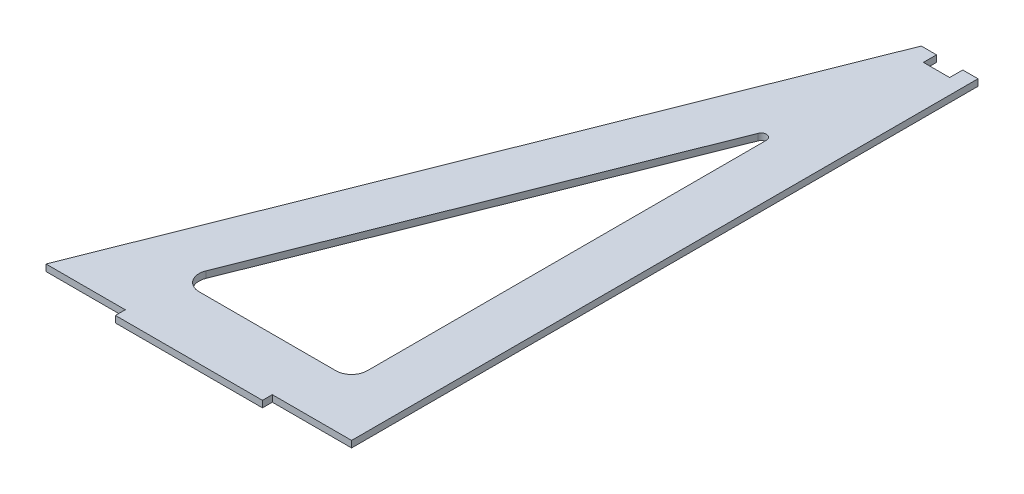
ISO-10303-21;
HEADER;
FILE_DESCRIPTION(('STEP AP214'),'2;1');
FILE_NAME('part.step','',(''),(''),'','','');
FILE_SCHEMA(('AUTOMOTIVE_DESIGN { 1 0 10303 214 1 1 1 1 }'));
ENDSEC;
DATA;
#1=APPLICATION_CONTEXT('core data for automotive mechanical design processes');
#2=APPLICATION_PROTOCOL_DEFINITION('international standard','automotive_design',2000,#1);
#3=PRODUCT_CONTEXT('',#1,'mechanical');
#4=PRODUCT('Part','Part','',(#3));
#5=PRODUCT_RELATED_PRODUCT_CATEGORY('part','',(#4));
#6=PRODUCT_DEFINITION_FORMATION('','',#4);
#7=PRODUCT_DEFINITION_CONTEXT('part definition',#1,'design');
#8=PRODUCT_DEFINITION('design','',#6,#7);
#9=PRODUCT_DEFINITION_SHAPE('','',#8);
#10=(LENGTH_UNIT() NAMED_UNIT(*) SI_UNIT(.MILLI.,.METRE.));
#11=(NAMED_UNIT(*) PLANE_ANGLE_UNIT() SI_UNIT($,.RADIAN.));
#12=(NAMED_UNIT(*) SI_UNIT($,.STERADIAN.) SOLID_ANGLE_UNIT());
#13=UNCERTAINTY_MEASURE_WITH_UNIT(LENGTH_MEASURE(1.E-05),#10,'distance_accuracy_value','');
#14=(GEOMETRIC_REPRESENTATION_CONTEXT(3) GLOBAL_UNCERTAINTY_ASSIGNED_CONTEXT((#13)) GLOBAL_UNIT_ASSIGNED_CONTEXT((#10,
#11,#12)) REPRESENTATION_CONTEXT('',''));
#15=CARTESIAN_POINT('',(0.,0.,0.));
#16=DIRECTION('',(0.,0.,1.));
#17=DIRECTION('',(1.,0.,0.));
#18=AXIS2_PLACEMENT_3D('',#15,#16,#17);
#19=CARTESIAN_POINT('',(0.,3.175,0.));
#20=DIRECTION('',(0.,0.,-1.));
#21=DIRECTION('',(-1.,0.,0.));
#22=AXIS2_PLACEMENT_3D('',#19,#20,#21);
#23=PLANE('',#22);
#24=DIRECTION('',(0.,-1.,0.));
#25=VECTOR('',#24,1.);
#26=CARTESIAN_POINT('',(-109.474,0.,0.));
#27=LINE('',#26,#25);
#28=CARTESIAN_POINT('',(-109.474,3.175,0.));
#29=VERTEX_POINT('',#28);
#30=CARTESIAN_POINT('',(-109.474,0.,0.));
#31=VERTEX_POINT('',#30);
#32=EDGE_CURVE('E55',#29,#31,#27,.T.);
#33=ORIENTED_EDGE('',*,*,#32,.F.);
#34=DIRECTION('',(1.,0.,0.));
#35=VECTOR('',#34,1.);
#36=CARTESIAN_POINT('',(0.,3.175,0.));
#37=LINE('',#36,#35);
#38=CARTESIAN_POINT('',(-147.828,3.175,0.));
#39=VERTEX_POINT('',#38);
#40=EDGE_CURVE('E269',#39,#29,#37,.T.);
#41=ORIENTED_EDGE('',*,*,#40,.F.);
#42=DIRECTION('',(0.,-1.,0.));
#43=VECTOR('',#42,1.);
#44=CARTESIAN_POINT('',(-147.828,3.175,0.));
#45=LINE('',#44,#43);
#46=CARTESIAN_POINT('',(-147.828,0.,0.));
#47=VERTEX_POINT('',#46);
#48=EDGE_CURVE('E290',#39,#47,#45,.T.);
#49=ORIENTED_EDGE('',*,*,#48,.T.);
#50=DIRECTION('',(1.,0.,0.));
#51=VECTOR('',#50,1.);
#52=CARTESIAN_POINT('',(0.,0.,0.));
#53=LINE('',#52,#51);
#54=EDGE_CURVE('E260',#47,#31,#53,.T.);
#55=ORIENTED_EDGE('',*,*,#54,.T.);
#56=EDGE_LOOP('',(#33,#41,#49,#55));
#57=FACE_BOUND('',#56,.T.);
#58=ADVANCED_FACE('F39',(#57),#23,.F.);
#59=DIRECTION('',(0.,1.,0.));
#60=VECTOR('',#59,1.);
#61=CARTESIAN_POINT('',(-38.354,0.,0.));
#62=LINE('',#61,#60);
#63=CARTESIAN_POINT('',(-38.354,0.,0.));
#64=VERTEX_POINT('',#63);
#65=CARTESIAN_POINT('',(-38.354,3.175,0.));
#66=VERTEX_POINT('',#65);
#67=EDGE_CURVE('E63',#64,#66,#62,.T.);
#68=ORIENTED_EDGE('',*,*,#67,.F.);
#69=CARTESIAN_POINT('',(0.,0.,0.));
#70=VERTEX_POINT('',#69);
#71=EDGE_CURVE('E284',#64,#70,#53,.T.);
#72=ORIENTED_EDGE('',*,*,#71,.T.);
#73=DIRECTION('',(0.,-1.,0.));
#74=VECTOR('',#73,1.);
#75=CARTESIAN_POINT('',(0.,3.175,0.));
#76=LINE('',#75,#74);
#77=CARTESIAN_POINT('',(0.,3.175,0.));
#78=VERTEX_POINT('',#77);
#79=EDGE_CURVE('E272',#78,#70,#76,.T.);
#80=ORIENTED_EDGE('',*,*,#79,.F.);
#81=EDGE_CURVE('E268',#66,#78,#37,.T.);
#82=ORIENTED_EDGE('',*,*,#81,.F.);
#83=EDGE_LOOP('',(#68,#72,#80,#82));
#84=FACE_BOUND('',#83,.T.);
#85=ADVANCED_FACE('F376',(#84),#23,.F.);
#86=CARTESIAN_POINT('',(-27.432,3.175,-303.022));
#87=DIRECTION('',(0.,0.,1.));
#88=DIRECTION('',(1.,0.,0.));
#89=AXIS2_PLACEMENT_3D('',#86,#87,#88);
#90=PLANE('',#89);
#91=DIRECTION('',(-1.,0.,0.));
#92=VECTOR('',#91,1.);
#93=CARTESIAN_POINT('',(-27.432,0.,-303.022));
#94=LINE('',#93,#92);
#95=CARTESIAN_POINT('',(0.,0.,-303.022));
#96=VERTEX_POINT('',#95);
#97=CARTESIAN_POINT('',(-7.366,0.,-303.022));
#98=VERTEX_POINT('',#97);
#99=EDGE_CURVE('E277',#96,#98,#94,.T.);
#100=ORIENTED_EDGE('',*,*,#99,.T.);
#101=DIRECTION('',(0.,1.,0.));
#102=VECTOR('',#101,1.);
#103=CARTESIAN_POINT('',(-7.366,0.,-303.022));
#104=LINE('',#103,#102);
#105=CARTESIAN_POINT('',(-7.366,3.175,-303.022));
#106=VERTEX_POINT('',#105);
#107=EDGE_CURVE('E220',#98,#106,#104,.T.);
#108=ORIENTED_EDGE('',*,*,#107,.T.);
#109=DIRECTION('',(-1.,0.,0.));
#110=VECTOR('',#109,1.);
#111=CARTESIAN_POINT('',(-27.432,3.175,-303.022));
#112=LINE('',#111,#110);
#113=CARTESIAN_POINT('',(0.,3.175,-303.022));
#114=VERTEX_POINT('',#113);
#115=EDGE_CURVE('E261',#114,#106,#112,.T.);
#116=ORIENTED_EDGE('',*,*,#115,.F.);
#117=DIRECTION('',(0.,-1.,0.));
#118=VECTOR('',#117,1.);
#119=CARTESIAN_POINT('',(0.,3.175,-303.022));
#120=LINE('',#119,#118);
#121=EDGE_CURVE('E298',#114,#96,#120,.T.);
#122=ORIENTED_EDGE('',*,*,#121,.T.);
#123=EDGE_LOOP('',(#100,#108,#116,#122));
#124=FACE_BOUND('',#123,.T.);
#125=ADVANCED_FACE('F381',(#124),#90,.F.);
#126=CARTESIAN_POINT('',(0.,3.175,-303.022));
#127=DIRECTION('',(-1.,0.,0.));
#128=DIRECTION('',(0.,0.,1.));
#129=AXIS2_PLACEMENT_3D('',#126,#127,#128);
#130=PLANE('',#129);
#131=DIRECTION('',(0.,0.,-1.));
#132=VECTOR('',#131,1.);
#133=CARTESIAN_POINT('',(0.,0.,-303.022));
#134=LINE('',#133,#132);
#135=EDGE_CURVE('E214',#70,#96,#134,.T.);
#136=ORIENTED_EDGE('',*,*,#135,.T.);
#137=ORIENTED_EDGE('',*,*,#121,.F.);
#138=DIRECTION('',(0.,0.,-1.));
#139=VECTOR('',#138,1.);
#140=CARTESIAN_POINT('',(0.,3.175,-303.022));
#141=LINE('',#140,#139);
#142=EDGE_CURVE('E255',#78,#114,#141,.T.);
#143=ORIENTED_EDGE('',*,*,#142,.F.);
#144=ORIENTED_EDGE('',*,*,#79,.T.);
#145=EDGE_LOOP('',(#136,#137,#143,#144));
#146=FACE_BOUND('',#145,.T.);
#147=ADVANCED_FACE('F391',(#146),#130,.F.);
#148=CARTESIAN_POINT('',(-20.066,3.175,-303.022));
#149=VERTEX_POINT('',#148);
#150=CARTESIAN_POINT('',(-27.432,3.175,-303.022));
#151=VERTEX_POINT('',#150);
#152=EDGE_CURVE('E259',#149,#151,#112,.T.);
#153=ORIENTED_EDGE('',*,*,#152,.F.);
#154=DIRECTION('',(0.,1.,0.));
#155=VECTOR('',#154,1.);
#156=CARTESIAN_POINT('',(-20.066,0.,-303.022));
#157=LINE('',#156,#155);
#158=CARTESIAN_POINT('',(-20.066,0.,-303.022));
#159=VERTEX_POINT('',#158);
#160=EDGE_CURVE('E237',#159,#149,#157,.T.);
#161=ORIENTED_EDGE('',*,*,#160,.F.);
#162=CARTESIAN_POINT('',(-27.432,0.,-303.022));
#163=VERTEX_POINT('',#162);
#164=EDGE_CURVE('E276',#159,#163,#94,.T.);
#165=ORIENTED_EDGE('',*,*,#164,.T.);
#166=DIRECTION('',(0.,-1.,0.));
#167=VECTOR('',#166,1.);
#168=CARTESIAN_POINT('',(-27.432,3.175,-303.022));
#169=LINE('',#168,#167);
#170=EDGE_CURVE('E294',#151,#163,#169,.T.);
#171=ORIENTED_EDGE('',*,*,#170,.F.);
#172=EDGE_LOOP('',(#153,#161,#165,#171));
#173=FACE_BOUND('',#172,.T.);
#174=ADVANCED_FACE('F388',(#173),#90,.F.);
#175=CARTESIAN_POINT('',(-147.828,3.175,0.));
#176=DIRECTION('',(0.92933377803258,0.,0.369240746678494));
#177=DIRECTION('',(0.369240746678494,0.,-0.92933377803258));
#178=AXIS2_PLACEMENT_3D('',#175,#176,#177);
#179=PLANE('',#178);
#180=DIRECTION('',(-0.369240746678494,0.,0.92933377803258));
#181=VECTOR('',#180,1.);
#182=CARTESIAN_POINT('',(-147.828,0.,0.));
#183=LINE('',#182,#181);
#184=EDGE_CURVE('E281',#163,#47,#183,.T.);
#185=ORIENTED_EDGE('',*,*,#184,.T.);
#186=ORIENTED_EDGE('',*,*,#48,.F.);
#187=DIRECTION('',(-0.369240746678494,0.,0.92933377803258));
#188=VECTOR('',#187,1.);
#189=CARTESIAN_POINT('',(-147.828,3.175,0.));
#190=LINE('',#189,#188);
#191=EDGE_CURVE('E265',#151,#39,#190,.T.);
#192=ORIENTED_EDGE('',*,*,#191,.F.);
#193=ORIENTED_EDGE('',*,*,#170,.T.);
#194=EDGE_LOOP('',(#185,#186,#192,#193));
#195=FACE_BOUND('',#194,.T.);
#196=ADVANCED_FACE('F385',(#195),#179,.F.);
#197=CARTESIAN_POINT('',(0.,3.175,0.));
#198=DIRECTION('',(0.,-1.,0.));
#199=DIRECTION('',(0.,0.,-1.));
#200=AXIS2_PLACEMENT_3D('',#197,#198,#199);
#201=PLANE('',#200);
#202=DIRECTION('',(0.,0.,-1.));
#203=VECTOR('',#202,1.);
#204=CARTESIAN_POINT('',(-25.4,3.175,-25.4));
#205=LINE('',#204,#203);
#206=CARTESIAN_POINT('',(-25.4,3.175,-33.02));
#207=VERTEX_POINT('',#206);
#208=CARTESIAN_POINT('',(-25.4,3.175,-226.074637568249));
#209=VERTEX_POINT('',#208);
#210=EDGE_CURVE('E219',#207,#209,#205,.T.);
#211=ORIENTED_EDGE('',*,*,#210,.F.);
#212=CARTESIAN_POINT('',(-33.02,3.175,-33.02));
#213=DIRECTION('',(0.,-1.,0.));
#214=DIRECTION('',(0.,0.,-1.));
#215=AXIS2_PLACEMENT_3D('',#212,#213,#214);
#216=CIRCLE('',#215,7.62);
#217=CARTESIAN_POINT('',(-33.02,3.175,-25.4));
#218=VERTEX_POINT('',#217);
#219=EDGE_CURVE('E317',#207,#218,#216,.T.);
#220=ORIENTED_EDGE('',*,*,#219,.T.);
#221=DIRECTION('',(1.,0.,0.));
#222=VECTOR('',#221,1.);
#223=CARTESIAN_POINT('',(-110.404723468224,3.175,-25.4));
#224=LINE('',#223,#222);
#225=CARTESIAN_POINT('',(-99.1777405086907,3.175,-25.4));
#226=VERTEX_POINT('',#225);
#227=EDGE_CURVE('E215',#226,#218,#224,.T.);
#228=ORIENTED_EDGE('',*,*,#227,.F.);
#229=CARTESIAN_POINT('',(-99.1777405086907,3.175,-33.02));
#230=DIRECTION('',(0.,-1.,0.));
#231=DIRECTION('',(0.,0.,-1.));
#232=AXIS2_PLACEMENT_3D('',#229,#230,#231);
#233=CIRCLE('',#232,7.62);
#234=CARTESIAN_POINT('',(-106.259263897299,3.175,-35.8336144896901));
#235=VERTEX_POINT('',#234);
#236=EDGE_CURVE('E323',#226,#235,#233,.T.);
#237=ORIENTED_EDGE('',*,*,#236,.T.);
#238=DIRECTION('',(-0.369240746678494,0.,0.92933377803258));
#239=VECTOR('',#238,1.);
#240=CARTESIAN_POINT('',(-25.4,3.175,-239.34648754766));
#241=LINE('',#240,#239);
#242=CARTESIAN_POINT('',(-30.3005077962028,3.175,-227.012509064812));
#243=VERTEX_POINT('',#242);
#244=EDGE_CURVE('E207',#243,#235,#241,.T.);
#245=ORIENTED_EDGE('',*,*,#244,.F.);
#246=CARTESIAN_POINT('',(-27.94,3.175,-226.074637568249));
#247=DIRECTION('',(0.,-1.,0.));
#248=DIRECTION('',(0.,0.,-1.));
#249=AXIS2_PLACEMENT_3D('',#246,#247,#248);
#250=CIRCLE('',#249,2.54);
#251=EDGE_CURVE('E48',#243,#209,#250,.T.);
#252=ORIENTED_EDGE('',*,*,#251,.T.);
#253=EDGE_LOOP('',(#211,#220,#228,#237,#245,#252));
#254=FACE_BOUND('',#253,.T.);
#255=ORIENTED_EDGE('',*,*,#115,.T.);
#256=DIRECTION('',(0.,0.,-1.));
#257=VECTOR('',#256,1.);
#258=CARTESIAN_POINT('',(-7.366,3.175,-303.022));
#259=LINE('',#258,#257);
#260=CARTESIAN_POINT('',(-7.36600000000001,3.175,-296.672));
#261=VERTEX_POINT('',#260);
#262=EDGE_CURVE('E231',#261,#106,#259,.T.);
#263=ORIENTED_EDGE('',*,*,#262,.F.);
#264=DIRECTION('',(1.,0.,0.));
#265=VECTOR('',#264,1.);
#266=CARTESIAN_POINT('',(-20.066,3.175,-296.672));
#267=LINE('',#266,#265);
#268=CARTESIAN_POINT('',(-20.066,3.175,-296.672));
#269=VERTEX_POINT('',#268);
#270=EDGE_CURVE('E196',#269,#261,#267,.T.);
#271=ORIENTED_EDGE('',*,*,#270,.F.);
#272=DIRECTION('',(0.,0.,1.));
#273=VECTOR('',#272,1.);
#274=CARTESIAN_POINT('',(-20.066,3.175,-303.022));
#275=LINE('',#274,#273);
#276=EDGE_CURVE('E191',#149,#269,#275,.T.);
#277=ORIENTED_EDGE('',*,*,#276,.F.);
#278=ORIENTED_EDGE('',*,*,#152,.T.);
#279=ORIENTED_EDGE('',*,*,#191,.T.);
#280=ORIENTED_EDGE('',*,*,#40,.T.);
#281=DIRECTION('',(0.,0.,-1.));
#282=VECTOR('',#281,1.);
#283=CARTESIAN_POINT('',(-109.474,3.175,4.7625));
#284=LINE('',#283,#282);
#285=CARTESIAN_POINT('',(-109.474,3.175,4.7625));
#286=VERTEX_POINT('',#285);
#287=EDGE_CURVE('E417',#286,#29,#284,.T.);
#288=ORIENTED_EDGE('',*,*,#287,.F.);
#289=DIRECTION('',(-1.,0.,0.));
#290=VECTOR('',#289,1.);
#291=CARTESIAN_POINT('',(-38.354,3.175,4.7625));
#292=LINE('',#291,#290);
#293=CARTESIAN_POINT('',(-38.354,3.175,4.7625));
#294=VERTEX_POINT('',#293);
#295=EDGE_CURVE('E183',#294,#286,#292,.T.);
#296=ORIENTED_EDGE('',*,*,#295,.F.);
#297=DIRECTION('',(0.,0.,-1.));
#298=VECTOR('',#297,1.);
#299=CARTESIAN_POINT('',(-38.354,3.175,4.7625));
#300=LINE('',#299,#298);
#301=EDGE_CURVE('E198',#294,#66,#300,.T.);
#302=ORIENTED_EDGE('',*,*,#301,.T.);
#303=ORIENTED_EDGE('',*,*,#81,.T.);
#304=ORIENTED_EDGE('',*,*,#142,.T.);
#305=EDGE_LOOP('',(#255,#263,#271,#277,#278,#279,#280,#288,#296,#302,#303,#304));
#306=FACE_BOUND('',#305,.T.);
#307=ADVANCED_FACE('F340',(#254,#306),#201,.F.);
#308=CARTESIAN_POINT('',(0.,0.,0.));
#309=DIRECTION('',(0.,-1.,0.));
#310=DIRECTION('',(0.,0.,-1.));
#311=AXIS2_PLACEMENT_3D('',#308,#309,#310);
#312=PLANE('',#311);
#313=DIRECTION('',(0.,0.,-1.));
#314=VECTOR('',#313,1.);
#315=CARTESIAN_POINT('',(-25.4,0.,-25.4));
#316=LINE('',#315,#314);
#317=CARTESIAN_POINT('',(-25.4,0.,-33.02));
#318=VERTEX_POINT('',#317);
#319=CARTESIAN_POINT('',(-25.4,0.,-226.074637568249));
#320=VERTEX_POINT('',#319);
#321=EDGE_CURVE('E206',#318,#320,#316,.T.);
#322=ORIENTED_EDGE('',*,*,#321,.T.);
#323=CARTESIAN_POINT('',(-27.94,0.,-226.074637568249));
#324=DIRECTION('',(0.,-1.,0.));
#325=DIRECTION('',(0.,0.,-1.));
#326=AXIS2_PLACEMENT_3D('',#323,#324,#325);
#327=CIRCLE('',#326,2.54);
#328=CARTESIAN_POINT('',(-30.3005077962028,0.,-227.012509064812));
#329=VERTEX_POINT('',#328);
#330=EDGE_CURVE('E11',#320,#329,#327,.F.);
#331=ORIENTED_EDGE('',*,*,#330,.T.);
#332=DIRECTION('',(-0.369240746678494,0.,0.92933377803258));
#333=VECTOR('',#332,1.);
#334=CARTESIAN_POINT('',(-25.4,0.,-239.34648754766));
#335=LINE('',#334,#333);
#336=CARTESIAN_POINT('',(-106.259263897299,0.,-35.8336144896901));
#337=VERTEX_POINT('',#336);
#338=EDGE_CURVE('E211',#329,#337,#335,.T.);
#339=ORIENTED_EDGE('',*,*,#338,.T.);
#340=CARTESIAN_POINT('',(-99.1777405086907,0.,-33.02));
#341=DIRECTION('',(0.,-1.,0.));
#342=DIRECTION('',(0.,0.,-1.));
#343=AXIS2_PLACEMENT_3D('',#340,#341,#342);
#344=CIRCLE('',#343,7.62);
#345=CARTESIAN_POINT('',(-99.1777405086907,0.,-25.4));
#346=VERTEX_POINT('',#345);
#347=EDGE_CURVE('E327',#337,#346,#344,.F.);
#348=ORIENTED_EDGE('',*,*,#347,.T.);
#349=DIRECTION('',(1.,0.,0.));
#350=VECTOR('',#349,1.);
#351=CARTESIAN_POINT('',(-110.404723468224,0.,-25.4));
#352=LINE('',#351,#350);
#353=CARTESIAN_POINT('',(-33.02,0.,-25.4));
#354=VERTEX_POINT('',#353);
#355=EDGE_CURVE('E202',#346,#354,#352,.T.);
#356=ORIENTED_EDGE('',*,*,#355,.T.);
#357=CARTESIAN_POINT('',(-33.02,0.,-33.02));
#358=DIRECTION('',(0.,-1.,0.));
#359=DIRECTION('',(0.,0.,-1.));
#360=AXIS2_PLACEMENT_3D('',#357,#358,#359);
#361=CIRCLE('',#360,7.62);
#362=EDGE_CURVE('E320',#354,#318,#361,.F.);
#363=ORIENTED_EDGE('',*,*,#362,.T.);
#364=EDGE_LOOP('',(#322,#331,#339,#348,#356,#363));
#365=FACE_BOUND('',#364,.T.);
#366=DIRECTION('',(0.,0.,-1.));
#367=VECTOR('',#366,1.);
#368=CARTESIAN_POINT('',(-7.366,0.,-303.022));
#369=LINE('',#368,#367);
#370=CARTESIAN_POINT('',(-7.36600000000001,0.,-296.672));
#371=VERTEX_POINT('',#370);
#372=EDGE_CURVE('E235',#371,#98,#369,.T.);
#373=ORIENTED_EDGE('',*,*,#372,.T.);
#374=ORIENTED_EDGE('',*,*,#99,.F.);
#375=ORIENTED_EDGE('',*,*,#135,.F.);
#376=ORIENTED_EDGE('',*,*,#71,.F.);
#377=DIRECTION('',(0.,0.,-1.));
#378=VECTOR('',#377,1.);
#379=CARTESIAN_POINT('',(-38.354,0.,4.7625));
#380=LINE('',#379,#378);
#381=CARTESIAN_POINT('',(-38.354,0.,4.7625));
#382=VERTEX_POINT('',#381);
#383=EDGE_CURVE('E173',#382,#64,#380,.T.);
#384=ORIENTED_EDGE('',*,*,#383,.F.);
#385=DIRECTION('',(1.,0.,0.));
#386=VECTOR('',#385,1.);
#387=CARTESIAN_POINT('',(-38.354,0.,4.7625));
#388=LINE('',#387,#386);
#389=CARTESIAN_POINT('',(-109.474,0.,4.7625));
#390=VERTEX_POINT('',#389);
#391=EDGE_CURVE('E165',#390,#382,#388,.T.);
#392=ORIENTED_EDGE('',*,*,#391,.F.);
#393=DIRECTION('',(0.,0.,-1.));
#394=VECTOR('',#393,1.);
#395=CARTESIAN_POINT('',(-109.474,0.,4.7625));
#396=LINE('',#395,#394);
#397=EDGE_CURVE('E171',#390,#31,#396,.T.);
#398=ORIENTED_EDGE('',*,*,#397,.T.);
#399=ORIENTED_EDGE('',*,*,#54,.F.);
#400=ORIENTED_EDGE('',*,*,#184,.F.);
#401=ORIENTED_EDGE('',*,*,#164,.F.);
#402=DIRECTION('',(0.,0.,1.));
#403=VECTOR('',#402,1.);
#404=CARTESIAN_POINT('',(-20.066,0.,-303.022));
#405=LINE('',#404,#403);
#406=CARTESIAN_POINT('',(-20.066,0.,-296.672));
#407=VERTEX_POINT('',#406);
#408=EDGE_CURVE('E226',#159,#407,#405,.T.);
#409=ORIENTED_EDGE('',*,*,#408,.T.);
#410=DIRECTION('',(1.,0.,0.));
#411=VECTOR('',#410,1.);
#412=CARTESIAN_POINT('',(-20.066,0.,-296.672));
#413=LINE('',#412,#411);
#414=EDGE_CURVE('E230',#407,#371,#413,.T.);
#415=ORIENTED_EDGE('',*,*,#414,.T.);
#416=EDGE_LOOP('',(#373,#374,#375,#376,#384,#392,#398,#399,#400,#401,#409,#415));
#417=FACE_BOUND('',#416,.T.);
#418=ADVANCED_FACE('F168',(#365,#417),#312,.T.);
#419=CARTESIAN_POINT('',(-7.366,0.,-303.022));
#420=DIRECTION('',(1.,0.,0.));
#421=DIRECTION('',(0.,0.,-1.));
#422=AXIS2_PLACEMENT_3D('',#419,#420,#421);
#423=PLANE('',#422);
#424=ORIENTED_EDGE('',*,*,#262,.T.);
#425=ORIENTED_EDGE('',*,*,#107,.F.);
#426=ORIENTED_EDGE('',*,*,#372,.F.);
#427=DIRECTION('',(0.,1.,0.));
#428=VECTOR('',#427,1.);
#429=CARTESIAN_POINT('',(-7.36600000000001,0.,-296.672));
#430=LINE('',#429,#428);
#431=EDGE_CURVE('E247',#371,#261,#430,.T.);
#432=ORIENTED_EDGE('',*,*,#431,.T.);
#433=EDGE_LOOP('',(#424,#425,#426,#432));
#434=FACE_BOUND('',#433,.T.);
#435=ADVANCED_FACE('F445',(#434),#423,.F.);
#436=CARTESIAN_POINT('',(-20.066,0.,-296.672));
#437=DIRECTION('',(0.,0.,1.));
#438=DIRECTION('',(1.,0.,0.));
#439=AXIS2_PLACEMENT_3D('',#436,#437,#438);
#440=PLANE('',#439);
#441=ORIENTED_EDGE('',*,*,#270,.T.);
#442=ORIENTED_EDGE('',*,*,#431,.F.);
#443=ORIENTED_EDGE('',*,*,#414,.F.);
#444=DIRECTION('',(0.,1.,0.));
#445=VECTOR('',#444,1.);
#446=CARTESIAN_POINT('',(-20.066,0.,-296.672));
#447=LINE('',#446,#445);
#448=EDGE_CURVE('E250',#407,#269,#447,.T.);
#449=ORIENTED_EDGE('',*,*,#448,.T.);
#450=EDGE_LOOP('',(#441,#442,#443,#449));
#451=FACE_BOUND('',#450,.T.);
#452=ADVANCED_FACE('F448',(#451),#440,.F.);
#453=CARTESIAN_POINT('',(-20.066,0.,-303.022));
#454=DIRECTION('',(-1.,0.,0.));
#455=DIRECTION('',(0.,0.,1.));
#456=AXIS2_PLACEMENT_3D('',#453,#454,#455);
#457=PLANE('',#456);
#458=ORIENTED_EDGE('',*,*,#276,.T.);
#459=ORIENTED_EDGE('',*,*,#448,.F.);
#460=ORIENTED_EDGE('',*,*,#408,.F.);
#461=ORIENTED_EDGE('',*,*,#160,.T.);
#462=EDGE_LOOP('',(#458,#459,#460,#461));
#463=FACE_BOUND('',#462,.T.);
#464=ADVANCED_FACE('F444',(#463),#457,.F.);
#465=CARTESIAN_POINT('',(-110.404723468224,0.,-25.4));
#466=DIRECTION('',(0.,0.,1.));
#467=DIRECTION('',(1.,0.,0.));
#468=AXIS2_PLACEMENT_3D('',#465,#466,#467);
#469=PLANE('',#468);
#470=ORIENTED_EDGE('',*,*,#227,.T.);
#471=DIRECTION('',(0.,1.,0.));
#472=VECTOR('',#471,1.);
#473=CARTESIAN_POINT('',(-33.02,0.,-25.4));
#474=LINE('',#473,#472);
#475=EDGE_CURVE('E310',#218,#354,#474,.F.);
#476=ORIENTED_EDGE('',*,*,#475,.T.);
#477=ORIENTED_EDGE('',*,*,#355,.F.);
#478=DIRECTION('',(0.,1.,0.));
#479=VECTOR('',#478,1.);
#480=CARTESIAN_POINT('',(-99.1777405086907,3.175,-25.4));
#481=LINE('',#480,#479);
#482=EDGE_CURVE('E306',#346,#226,#481,.T.);
#483=ORIENTED_EDGE('',*,*,#482,.T.);
#484=EDGE_LOOP('',(#470,#476,#477,#483));
#485=FACE_BOUND('',#484,.T.);
#486=ADVANCED_FACE('F362',(#485),#469,.F.);
#487=CARTESIAN_POINT('',(-25.4,0.,-239.34648754766));
#488=DIRECTION('',(-0.92933377803258,0.,-0.369240746678494));
#489=DIRECTION('',(-0.369240746678494,0.,0.92933377803258));
#490=AXIS2_PLACEMENT_3D('',#487,#488,#489);
#491=PLANE('',#490);
#492=ORIENTED_EDGE('',*,*,#338,.F.);
#493=DIRECTION('',(0.,1.,0.));
#494=VECTOR('',#493,1.);
#495=CARTESIAN_POINT('',(-30.3005077962028,3.175,-227.012509064812));
#496=LINE('',#495,#494);
#497=EDGE_CURVE('E330',#329,#243,#496,.T.);
#498=ORIENTED_EDGE('',*,*,#497,.T.);
#499=ORIENTED_EDGE('',*,*,#244,.T.);
#500=DIRECTION('',(0.,1.,0.));
#501=VECTOR('',#500,1.);
#502=CARTESIAN_POINT('',(-106.259263897299,0.,-35.8336144896901));
#503=LINE('',#502,#501);
#504=EDGE_CURVE('E313',#235,#337,#503,.F.);
#505=ORIENTED_EDGE('',*,*,#504,.T.);
#506=EDGE_LOOP('',(#492,#498,#499,#505));
#507=FACE_BOUND('',#506,.T.);
#508=ADVANCED_FACE('F353',(#507),#491,.F.);
#509=CARTESIAN_POINT('',(-25.4,0.,-25.4));
#510=DIRECTION('',(1.,0.,0.));
#511=DIRECTION('',(0.,0.,-1.));
#512=AXIS2_PLACEMENT_3D('',#509,#510,#511);
#513=PLANE('',#512);
#514=ORIENTED_EDGE('',*,*,#210,.T.);
#515=DIRECTION('',(0.,1.,0.));
#516=VECTOR('',#515,1.);
#517=CARTESIAN_POINT('',(-25.4,0.,-226.074637568249));
#518=LINE('',#517,#516);
#519=EDGE_CURVE('E334',#209,#320,#518,.F.);
#520=ORIENTED_EDGE('',*,*,#519,.T.);
#521=ORIENTED_EDGE('',*,*,#321,.F.);
#522=DIRECTION('',(0.,1.,0.));
#523=VECTOR('',#522,1.);
#524=CARTESIAN_POINT('',(-25.4,3.175,-33.02));
#525=LINE('',#524,#523);
#526=EDGE_CURVE('E302',#318,#207,#525,.T.);
#527=ORIENTED_EDGE('',*,*,#526,.T.);
#528=EDGE_LOOP('',(#514,#520,#521,#527));
#529=FACE_BOUND('',#528,.T.);
#530=ADVANCED_FACE('F346',(#529),#513,.F.);
#531=CARTESIAN_POINT('',(-33.02,0.,-33.02));
#532=DIRECTION('',(0.,-1.,0.));
#533=DIRECTION('',(0.,0.,-1.));
#534=AXIS2_PLACEMENT_3D('',#531,#532,#533);
#535=CYLINDRICAL_SURFACE('',#534,7.62);
#536=ORIENTED_EDGE('',*,*,#362,.F.);
#537=ORIENTED_EDGE('',*,*,#475,.F.);
#538=ORIENTED_EDGE('',*,*,#219,.F.);
#539=ORIENTED_EDGE('',*,*,#526,.F.);
#540=EDGE_LOOP('',(#536,#537,#538,#539));
#541=FACE_BOUND('',#540,.T.);
#542=ADVANCED_FACE('F366',(#541),#535,.F.);
#543=CARTESIAN_POINT('',(-99.1777405086907,0.,-33.02));
#544=DIRECTION('',(0.,-1.,0.));
#545=DIRECTION('',(0.,0.,-1.));
#546=AXIS2_PLACEMENT_3D('',#543,#544,#545);
#547=CYLINDRICAL_SURFACE('',#546,7.62);
#548=ORIENTED_EDGE('',*,*,#347,.F.);
#549=ORIENTED_EDGE('',*,*,#504,.F.);
#550=ORIENTED_EDGE('',*,*,#236,.F.);
#551=ORIENTED_EDGE('',*,*,#482,.F.);
#552=EDGE_LOOP('',(#548,#549,#550,#551));
#553=FACE_BOUND('',#552,.T.);
#554=ADVANCED_FACE('F358',(#553),#547,.F.);
#555=CARTESIAN_POINT('',(-27.94,0.,-226.074637568249));
#556=DIRECTION('',(0.,-1.,0.));
#557=DIRECTION('',(0.,0.,-1.));
#558=AXIS2_PLACEMENT_3D('',#555,#556,#557);
#559=CYLINDRICAL_SURFACE('',#558,2.54);
#560=ORIENTED_EDGE('',*,*,#330,.F.);
#561=ORIENTED_EDGE('',*,*,#519,.F.);
#562=ORIENTED_EDGE('',*,*,#251,.F.);
#563=ORIENTED_EDGE('',*,*,#497,.F.);
#564=EDGE_LOOP('',(#560,#561,#562,#563));
#565=FACE_BOUND('',#564,.T.);
#566=ADVANCED_FACE('F41',(#565),#559,.F.);
#567=CARTESIAN_POINT('',(-109.474,0.,4.7625));
#568=DIRECTION('',(1.,0.,0.));
#569=DIRECTION('',(0.,0.,-1.));
#570=AXIS2_PLACEMENT_3D('',#567,#568,#569);
#571=PLANE('',#570);
#572=ORIENTED_EDGE('',*,*,#32,.T.);
#573=ORIENTED_EDGE('',*,*,#397,.F.);
#574=DIRECTION('',(0.,-1.,0.));
#575=VECTOR('',#574,1.);
#576=CARTESIAN_POINT('',(-109.474,0.,4.7625));
#577=LINE('',#576,#575);
#578=EDGE_CURVE('E178',#286,#390,#577,.T.);
#579=ORIENTED_EDGE('',*,*,#578,.F.);
#580=ORIENTED_EDGE('',*,*,#287,.T.);
#581=EDGE_LOOP('',(#572,#573,#579,#580));
#582=FACE_BOUND('',#581,.T.);
#583=ADVANCED_FACE('F189',(#582),#571,.F.);
#584=CARTESIAN_POINT('',(-38.354,0.,4.7625));
#585=DIRECTION('',(-1.,0.,0.));
#586=DIRECTION('',(0.,0.,1.));
#587=AXIS2_PLACEMENT_3D('',#584,#585,#586);
#588=PLANE('',#587);
#589=ORIENTED_EDGE('',*,*,#67,.T.);
#590=ORIENTED_EDGE('',*,*,#301,.F.);
#591=DIRECTION('',(0.,1.,0.));
#592=VECTOR('',#591,1.);
#593=CARTESIAN_POINT('',(-38.354,0.,4.7625));
#594=LINE('',#593,#592);
#595=EDGE_CURVE('E177',#382,#294,#594,.T.);
#596=ORIENTED_EDGE('',*,*,#595,.F.);
#597=ORIENTED_EDGE('',*,*,#383,.T.);
#598=EDGE_LOOP('',(#589,#590,#596,#597));
#599=FACE_BOUND('',#598,.T.);
#600=ADVANCED_FACE('F430',(#599),#588,.F.);
#601=CARTESIAN_POINT('',(0.,0.,4.7625));
#602=DIRECTION('',(0.,0.,1.));
#603=DIRECTION('',(1.,0.,0.));
#604=AXIS2_PLACEMENT_3D('',#601,#602,#603);
#605=PLANE('',#604);
#606=ORIENTED_EDGE('',*,*,#578,.T.);
#607=ORIENTED_EDGE('',*,*,#391,.T.);
#608=ORIENTED_EDGE('',*,*,#595,.T.);
#609=ORIENTED_EDGE('',*,*,#295,.T.);
#610=EDGE_LOOP('',(#606,#607,#608,#609));
#611=FACE_BOUND('',#610,.T.);
#612=ADVANCED_FACE('F181',(#611),#605,.T.);
#613=CLOSED_SHELL('',(#58,#85,#125,#147,#174,#196,#307,#418,#435,#452,#464,#486,#508,#530,#542,
#554,#566,#583,#600,#612));
#614=MANIFOLD_SOLID_BREP('B2',#613);
#615=ADVANCED_BREP_SHAPE_REPRESENTATION('',(#18,#614),#14);
#616=SHAPE_DEFINITION_REPRESENTATION(#9,#615);
ENDSEC;
END-ISO-10303-21;
